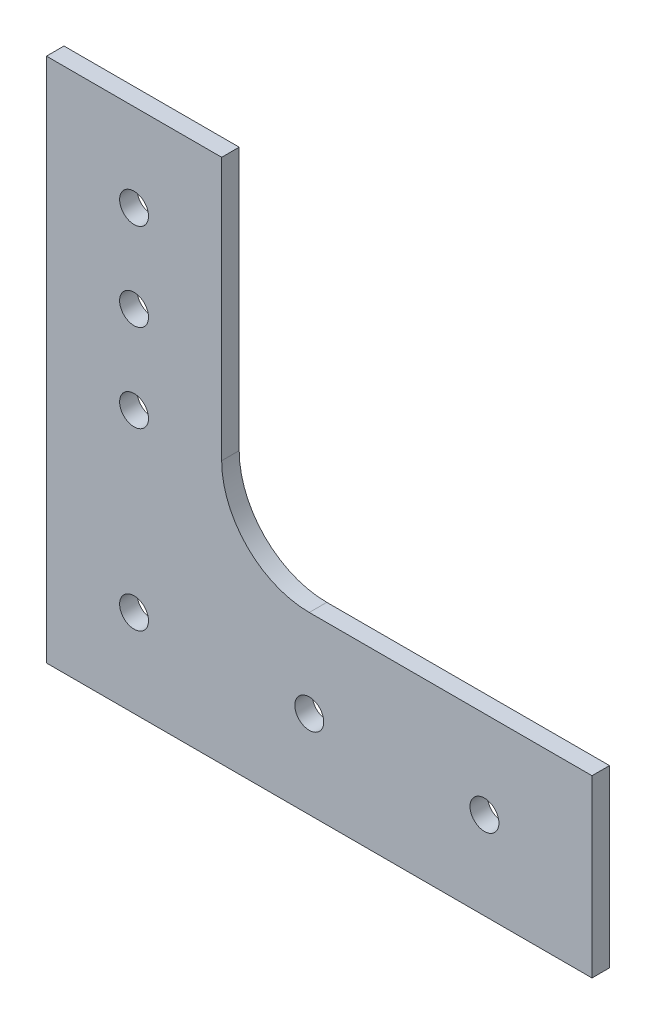
ISO-10303-21;
HEADER;
FILE_DESCRIPTION(('STEP AP214'),'2;1');
FILE_NAME('part.step','',(''),(''),'','','');
FILE_SCHEMA(('AUTOMOTIVE_DESIGN { 1 0 10303 214 1 1 1 1 }'));
ENDSEC;
DATA;
#1=APPLICATION_CONTEXT('core data for automotive mechanical design processes');
#2=APPLICATION_PROTOCOL_DEFINITION('international standard','automotive_design',2000,#1);
#3=PRODUCT_CONTEXT('',#1,'mechanical');
#4=PRODUCT('Part','Part','',(#3));
#5=PRODUCT_RELATED_PRODUCT_CATEGORY('part','',(#4));
#6=PRODUCT_DEFINITION_FORMATION('','',#4);
#7=PRODUCT_DEFINITION_CONTEXT('part definition',#1,'design');
#8=PRODUCT_DEFINITION('design','',#6,#7);
#9=PRODUCT_DEFINITION_SHAPE('','',#8);
#10=(LENGTH_UNIT() NAMED_UNIT(*) SI_UNIT(.MILLI.,.METRE.));
#11=(NAMED_UNIT(*) PLANE_ANGLE_UNIT() SI_UNIT($,.RADIAN.));
#12=(NAMED_UNIT(*) SI_UNIT($,.STERADIAN.) SOLID_ANGLE_UNIT());
#13=UNCERTAINTY_MEASURE_WITH_UNIT(LENGTH_MEASURE(1.E-05),#10,'distance_accuracy_value','');
#14=(GEOMETRIC_REPRESENTATION_CONTEXT(3) GLOBAL_UNCERTAINTY_ASSIGNED_CONTEXT((#13)) GLOBAL_UNIT_ASSIGNED_CONTEXT((#10,
#11,#12)) REPRESENTATION_CONTEXT('',''));
#15=CARTESIAN_POINT('',(0.,0.,0.));
#16=DIRECTION('',(0.,0.,1.));
#17=DIRECTION('',(1.,0.,0.));
#18=AXIS2_PLACEMENT_3D('',#15,#16,#17);
#19=CARTESIAN_POINT('',(0.,0.,2.));
#20=DIRECTION('',(0.,0.,-1.));
#21=DIRECTION('',(-1.,0.,0.));
#22=AXIS2_PLACEMENT_3D('',#19,#20,#21);
#23=PLANE('',#22);
#24=DIRECTION('',(0.,1.,0.));
#25=VECTOR('',#24,1.);
#26=CARTESIAN_POINT('',(52.2764122765606,-10.,2.));
#27=LINE('',#26,#25);
#28=CARTESIAN_POINT('',(52.2764122765606,-10.,2.));
#29=VERTEX_POINT('',#28);
#30=CARTESIAN_POINT('',(52.2764122765606,10.,2.));
#31=VERTEX_POINT('',#30);
#32=EDGE_CURVE('E105',#29,#31,#27,.T.);
#33=ORIENTED_EDGE('',*,*,#32,.T.);
#34=DIRECTION('',(-1.,0.,0.));
#35=VECTOR('',#34,1.);
#36=CARTESIAN_POINT('',(10.,10.,2.));
#37=LINE('',#36,#35);
#38=CARTESIAN_POINT('',(20.,10.,2.));
#39=VERTEX_POINT('',#38);
#40=EDGE_CURVE('E96',#31,#39,#37,.T.);
#41=ORIENTED_EDGE('',*,*,#40,.T.);
#42=CARTESIAN_POINT('',(20.,20.,2.));
#43=DIRECTION('',(0.,0.,-1.));
#44=DIRECTION('',(-1.,0.,0.));
#45=AXIS2_PLACEMENT_3D('',#42,#43,#44);
#46=CIRCLE('',#45,10.);
#47=CARTESIAN_POINT('',(10.,20.,2.));
#48=VERTEX_POINT('',#47);
#49=EDGE_CURVE('E11',#39,#48,#46,.T.);
#50=ORIENTED_EDGE('',*,*,#49,.T.);
#51=DIRECTION('',(0.,1.,0.));
#52=VECTOR('',#51,1.);
#53=CARTESIAN_POINT('',(10.,10.,2.));
#54=LINE('',#53,#52);
#55=CARTESIAN_POINT('',(10.,50.,2.));
#56=VERTEX_POINT('',#55);
#57=EDGE_CURVE('E104',#48,#56,#54,.T.);
#58=ORIENTED_EDGE('',*,*,#57,.T.);
#59=DIRECTION('',(-1.,0.,0.));
#60=VECTOR('',#59,1.);
#61=CARTESIAN_POINT('',(-9.99999999999999,50.,2.));
#62=LINE('',#61,#60);
#63=CARTESIAN_POINT('',(-9.99999999999999,50.,2.));
#64=VERTEX_POINT('',#63);
#65=EDGE_CURVE('E151',#56,#64,#62,.T.);
#66=ORIENTED_EDGE('',*,*,#65,.T.);
#67=DIRECTION('',(0.,-1.,0.));
#68=VECTOR('',#67,1.);
#69=CARTESIAN_POINT('',(-9.99999999999999,10.,2.));
#70=LINE('',#69,#68);
#71=CARTESIAN_POINT('',(-9.99999999999999,-10.,2.));
#72=VERTEX_POINT('',#71);
#73=EDGE_CURVE('E149',#64,#72,#70,.T.);
#74=ORIENTED_EDGE('',*,*,#73,.T.);
#75=DIRECTION('',(1.,0.,0.));
#76=VECTOR('',#75,1.);
#77=CARTESIAN_POINT('',(-9.99999999999999,-10.,2.));
#78=LINE('',#77,#76);
#79=EDGE_CURVE('E110',#72,#29,#78,.T.);
#80=ORIENTED_EDGE('',*,*,#79,.T.);
#81=EDGE_LOOP('',(#33,#41,#50,#58,#66,#74,#80));
#82=FACE_BOUND('',#81,.T.);
#83=CARTESIAN_POINT('',(0.,0.,2.));
#84=DIRECTION('',(0.,0.,1.));
#85=DIRECTION('',(1.,0.,0.));
#86=AXIS2_PLACEMENT_3D('',#83,#84,#85);
#87=CIRCLE('',#86,1.65);
#88=CARTESIAN_POINT('',(1.65,0.,2.));
#89=VERTEX_POINT('',#88);
#90=EDGE_CURVE('E147',#89,#89,#87,.T.);
#91=ORIENTED_EDGE('',*,*,#90,.F.);
#92=EDGE_LOOP('',(#91));
#93=FACE_BOUND('',#92,.T.);
#94=CARTESIAN_POINT('',(20.,0.,2.));
#95=DIRECTION('',(0.,0.,1.));
#96=DIRECTION('',(1.,0.,0.));
#97=AXIS2_PLACEMENT_3D('',#94,#95,#96);
#98=CIRCLE('',#97,1.65);
#99=CARTESIAN_POINT('',(21.65,0.,2.));
#100=VERTEX_POINT('',#99);
#101=EDGE_CURVE('E157',#100,#100,#98,.T.);
#102=ORIENTED_EDGE('',*,*,#101,.F.);
#103=EDGE_LOOP('',(#102));
#104=FACE_BOUND('',#103,.T.);
#105=CARTESIAN_POINT('',(3.05033872050053E-05,20.,2.));
#106=DIRECTION('',(0.,0.,1.));
#107=DIRECTION('',(1.,0.,0.));
#108=AXIS2_PLACEMENT_3D('',#105,#106,#107);
#109=CIRCLE('',#108,1.65);
#110=CARTESIAN_POINT('',(1.6500305033872,20.,2.));
#111=VERTEX_POINT('',#110);
#112=EDGE_CURVE('E163',#111,#111,#109,.T.);
#113=ORIENTED_EDGE('',*,*,#112,.F.);
#114=EDGE_LOOP('',(#113));
#115=FACE_BOUND('',#114,.T.);
#116=CARTESIAN_POINT('',(3.05033872050053E-05,30.,2.));
#117=DIRECTION('',(0.,0.,1.));
#118=DIRECTION('',(1.,0.,0.));
#119=AXIS2_PLACEMENT_3D('',#116,#117,#118);
#120=CIRCLE('',#119,1.65);
#121=CARTESIAN_POINT('',(1.6500305033872,30.,2.));
#122=VERTEX_POINT('',#121);
#123=EDGE_CURVE('E169',#122,#122,#120,.T.);
#124=ORIENTED_EDGE('',*,*,#123,.F.);
#125=EDGE_LOOP('',(#124));
#126=FACE_BOUND('',#125,.T.);
#127=CARTESIAN_POINT('',(3.05033872065226E-05,40.,2.));
#128=DIRECTION('',(0.,0.,1.));
#129=DIRECTION('',(1.,0.,0.));
#130=AXIS2_PLACEMENT_3D('',#127,#128,#129);
#131=CIRCLE('',#130,1.65);
#132=CARTESIAN_POINT('',(1.65003050338721,40.,2.));
#133=VERTEX_POINT('',#132);
#134=EDGE_CURVE('E175',#133,#133,#131,.T.);
#135=ORIENTED_EDGE('',*,*,#134,.F.);
#136=EDGE_LOOP('',(#135));
#137=FACE_BOUND('',#136,.T.);
#138=CARTESIAN_POINT('',(40.,0.,2.));
#139=DIRECTION('',(0.,0.,1.));
#140=DIRECTION('',(1.,0.,0.));
#141=AXIS2_PLACEMENT_3D('',#138,#139,#140);
#142=CIRCLE('',#141,1.65);
#143=CARTESIAN_POINT('',(41.65,0.,2.));
#144=VERTEX_POINT('',#143);
#145=EDGE_CURVE('E181',#144,#144,#142,.T.);
#146=ORIENTED_EDGE('',*,*,#145,.F.);
#147=EDGE_LOOP('',(#146));
#148=FACE_BOUND('',#147,.T.);
#149=ADVANCED_FACE('F41',(#82,#93,#104,#115,#126,#137,#148),#23,.F.);
#150=CARTESIAN_POINT('',(0.,0.,0.));
#151=DIRECTION('',(0.,0.,-1.));
#152=DIRECTION('',(-1.,0.,0.));
#153=AXIS2_PLACEMENT_3D('',#150,#151,#152);
#154=PLANE('',#153);
#155=CARTESIAN_POINT('',(3.05033872065226E-05,40.,0.));
#156=DIRECTION('',(0.,0.,1.));
#157=DIRECTION('',(1.,0.,0.));
#158=AXIS2_PLACEMENT_3D('',#155,#156,#157);
#159=CIRCLE('',#158,1.65);
#160=CARTESIAN_POINT('',(1.65003050338721,40.,0.));
#161=VERTEX_POINT('',#160);
#162=EDGE_CURVE('E178',#161,#161,#159,.T.);
#163=ORIENTED_EDGE('',*,*,#162,.T.);
#164=EDGE_LOOP('',(#163));
#165=FACE_BOUND('',#164,.T.);
#166=CARTESIAN_POINT('',(3.05033872050053E-05,20.,0.));
#167=DIRECTION('',(0.,0.,1.));
#168=DIRECTION('',(1.,0.,0.));
#169=AXIS2_PLACEMENT_3D('',#166,#167,#168);
#170=CIRCLE('',#169,1.65);
#171=CARTESIAN_POINT('',(1.6500305033872,20.,0.));
#172=VERTEX_POINT('',#171);
#173=EDGE_CURVE('E166',#172,#172,#170,.T.);
#174=ORIENTED_EDGE('',*,*,#173,.T.);
#175=EDGE_LOOP('',(#174));
#176=FACE_BOUND('',#175,.T.);
#177=CARTESIAN_POINT('',(0.,0.,0.));
#178=DIRECTION('',(0.,0.,1.));
#179=DIRECTION('',(1.,0.,0.));
#180=AXIS2_PLACEMENT_3D('',#177,#178,#179);
#181=CIRCLE('',#180,1.65);
#182=CARTESIAN_POINT('',(1.65,0.,0.));
#183=VERTEX_POINT('',#182);
#184=EDGE_CURVE('E154',#183,#183,#181,.T.);
#185=ORIENTED_EDGE('',*,*,#184,.T.);
#186=EDGE_LOOP('',(#185));
#187=FACE_BOUND('',#186,.T.);
#188=DIRECTION('',(0.,1.,0.));
#189=VECTOR('',#188,1.);
#190=CARTESIAN_POINT('',(52.2764122765606,-10.,0.));
#191=LINE('',#190,#189);
#192=CARTESIAN_POINT('',(52.2764122765606,-10.,0.));
#193=VERTEX_POINT('',#192);
#194=CARTESIAN_POINT('',(52.2764122765606,10.,0.));
#195=VERTEX_POINT('',#194);
#196=EDGE_CURVE('E118',#193,#195,#191,.T.);
#197=ORIENTED_EDGE('',*,*,#196,.F.);
#198=DIRECTION('',(1.,0.,0.));
#199=VECTOR('',#198,1.);
#200=CARTESIAN_POINT('',(-9.99999999999999,-10.,0.));
#201=LINE('',#200,#199);
#202=CARTESIAN_POINT('',(-9.99999999999999,-10.,0.));
#203=VERTEX_POINT('',#202);
#204=EDGE_CURVE('E114',#203,#193,#201,.T.);
#205=ORIENTED_EDGE('',*,*,#204,.F.);
#206=DIRECTION('',(0.,-1.,0.));
#207=VECTOR('',#206,1.);
#208=CARTESIAN_POINT('',(-9.99999999999999,10.,0.));
#209=LINE('',#208,#207);
#210=CARTESIAN_POINT('',(-9.99999999999999,50.,0.));
#211=VERTEX_POINT('',#210);
#212=EDGE_CURVE('E137',#211,#203,#209,.T.);
#213=ORIENTED_EDGE('',*,*,#212,.F.);
#214=DIRECTION('',(-1.,0.,0.));
#215=VECTOR('',#214,1.);
#216=CARTESIAN_POINT('',(-9.99999999999999,50.,0.));
#217=LINE('',#216,#215);
#218=CARTESIAN_POINT('',(10.,50.,0.));
#219=VERTEX_POINT('',#218);
#220=EDGE_CURVE('E139',#219,#211,#217,.T.);
#221=ORIENTED_EDGE('',*,*,#220,.F.);
#222=DIRECTION('',(0.,1.,0.));
#223=VECTOR('',#222,1.);
#224=CARTESIAN_POINT('',(10.,10.,0.));
#225=LINE('',#224,#223);
#226=CARTESIAN_POINT('',(10.,20.,0.));
#227=VERTEX_POINT('',#226);
#228=EDGE_CURVE('E142',#227,#219,#225,.T.);
#229=ORIENTED_EDGE('',*,*,#228,.F.);
#230=CARTESIAN_POINT('',(20.,20.,0.));
#231=DIRECTION('',(0.,0.,-1.));
#232=DIRECTION('',(-1.,0.,0.));
#233=AXIS2_PLACEMENT_3D('',#230,#231,#232);
#234=CIRCLE('',#233,10.);
#235=CARTESIAN_POINT('',(20.,10.,0.));
#236=VERTEX_POINT('',#235);
#237=EDGE_CURVE('E49',#227,#236,#234,.F.);
#238=ORIENTED_EDGE('',*,*,#237,.T.);
#239=DIRECTION('',(-1.,0.,0.));
#240=VECTOR('',#239,1.);
#241=CARTESIAN_POINT('',(10.,10.,0.));
#242=LINE('',#241,#240);
#243=EDGE_CURVE('E144',#195,#236,#242,.T.);
#244=ORIENTED_EDGE('',*,*,#243,.F.);
#245=EDGE_LOOP('',(#197,#205,#213,#221,#229,#238,#244));
#246=FACE_BOUND('',#245,.T.);
#247=CARTESIAN_POINT('',(20.,0.,0.));
#248=DIRECTION('',(0.,0.,1.));
#249=DIRECTION('',(1.,0.,0.));
#250=AXIS2_PLACEMENT_3D('',#247,#248,#249);
#251=CIRCLE('',#250,1.65);
#252=CARTESIAN_POINT('',(21.65,0.,0.));
#253=VERTEX_POINT('',#252);
#254=EDGE_CURVE('E160',#253,#253,#251,.T.);
#255=ORIENTED_EDGE('',*,*,#254,.T.);
#256=EDGE_LOOP('',(#255));
#257=FACE_BOUND('',#256,.T.);
#258=CARTESIAN_POINT('',(3.05033872050053E-05,30.,0.));
#259=DIRECTION('',(0.,0.,1.));
#260=DIRECTION('',(1.,0.,0.));
#261=AXIS2_PLACEMENT_3D('',#258,#259,#260);
#262=CIRCLE('',#261,1.65);
#263=CARTESIAN_POINT('',(1.6500305033872,30.,0.));
#264=VERTEX_POINT('',#263);
#265=EDGE_CURVE('E172',#264,#264,#262,.T.);
#266=ORIENTED_EDGE('',*,*,#265,.T.);
#267=EDGE_LOOP('',(#266));
#268=FACE_BOUND('',#267,.T.);
#269=CARTESIAN_POINT('',(40.,0.,0.));
#270=DIRECTION('',(0.,0.,1.));
#271=DIRECTION('',(1.,0.,0.));
#272=AXIS2_PLACEMENT_3D('',#269,#270,#271);
#273=CIRCLE('',#272,1.65);
#274=CARTESIAN_POINT('',(41.65,0.,0.));
#275=VERTEX_POINT('',#274);
#276=EDGE_CURVE('E184',#275,#275,#273,.T.);
#277=ORIENTED_EDGE('',*,*,#276,.T.);
#278=EDGE_LOOP('',(#277));
#279=FACE_BOUND('',#278,.T.);
#280=ADVANCED_FACE('F194',(#165,#176,#187,#246,#257,#268,#279),#154,.T.);
#281=CARTESIAN_POINT('',(52.2764122765606,-10.,2.));
#282=DIRECTION('',(-1.,0.,0.));
#283=DIRECTION('',(0.,0.,1.));
#284=AXIS2_PLACEMENT_3D('',#281,#282,#283);
#285=PLANE('',#284);
#286=ORIENTED_EDGE('',*,*,#196,.T.);
#287=DIRECTION('',(0.,0.,-1.));
#288=VECTOR('',#287,1.);
#289=CARTESIAN_POINT('',(52.2764122765606,10.,2.));
#290=LINE('',#289,#288);
#291=EDGE_CURVE('E100',#31,#195,#290,.T.);
#292=ORIENTED_EDGE('',*,*,#291,.F.);
#293=ORIENTED_EDGE('',*,*,#32,.F.);
#294=DIRECTION('',(0.,0.,-1.));
#295=VECTOR('',#294,1.);
#296=CARTESIAN_POINT('',(52.2764122765606,-10.,2.));
#297=LINE('',#296,#295);
#298=EDGE_CURVE('E134',#29,#193,#297,.T.);
#299=ORIENTED_EDGE('',*,*,#298,.T.);
#300=EDGE_LOOP('',(#286,#292,#293,#299));
#301=FACE_BOUND('',#300,.T.);
#302=ADVANCED_FACE('F116',(#301),#285,.F.);
#303=CARTESIAN_POINT('',(10.,10.,2.));
#304=DIRECTION('',(0.,-1.,0.));
#305=DIRECTION('',(0.,0.,-1.));
#306=AXIS2_PLACEMENT_3D('',#303,#304,#305);
#307=PLANE('',#306);
#308=ORIENTED_EDGE('',*,*,#243,.T.);
#309=DIRECTION('',(0.,0.,-1.));
#310=VECTOR('',#309,1.);
#311=CARTESIAN_POINT('',(20.,10.,2.));
#312=LINE('',#311,#310);
#313=EDGE_CURVE('E56',#236,#39,#312,.F.);
#314=ORIENTED_EDGE('',*,*,#313,.T.);
#315=ORIENTED_EDGE('',*,*,#40,.F.);
#316=ORIENTED_EDGE('',*,*,#291,.T.);
#317=EDGE_LOOP('',(#308,#314,#315,#316));
#318=FACE_BOUND('',#317,.T.);
#319=ADVANCED_FACE('F98',(#318),#307,.F.);
#320=CARTESIAN_POINT('',(10.,10.,2.));
#321=DIRECTION('',(-1.,0.,0.));
#322=DIRECTION('',(0.,0.,1.));
#323=AXIS2_PLACEMENT_3D('',#320,#321,#322);
#324=PLANE('',#323);
#325=ORIENTED_EDGE('',*,*,#57,.F.);
#326=DIRECTION('',(0.,0.,-1.));
#327=VECTOR('',#326,1.);
#328=CARTESIAN_POINT('',(10.,20.,0.));
#329=LINE('',#328,#327);
#330=EDGE_CURVE('E119',#48,#227,#329,.T.);
#331=ORIENTED_EDGE('',*,*,#330,.T.);
#332=ORIENTED_EDGE('',*,*,#228,.T.);
#333=DIRECTION('',(0.,0.,-1.));
#334=VECTOR('',#333,1.);
#335=CARTESIAN_POINT('',(10.,50.,2.));
#336=LINE('',#335,#334);
#337=EDGE_CURVE('E120',#56,#219,#336,.T.);
#338=ORIENTED_EDGE('',*,*,#337,.F.);
#339=EDGE_LOOP('',(#325,#331,#332,#338));
#340=FACE_BOUND('',#339,.T.);
#341=ADVANCED_FACE('F217',(#340),#324,.F.);
#342=CARTESIAN_POINT('',(-9.99999999999999,50.,2.));
#343=DIRECTION('',(0.,-1.,0.));
#344=DIRECTION('',(0.,0.,-1.));
#345=AXIS2_PLACEMENT_3D('',#342,#343,#344);
#346=PLANE('',#345);
#347=ORIENTED_EDGE('',*,*,#220,.T.);
#348=DIRECTION('',(0.,0.,-1.));
#349=VECTOR('',#348,1.);
#350=CARTESIAN_POINT('',(-9.99999999999999,50.,2.));
#351=LINE('',#350,#349);
#352=EDGE_CURVE('E125',#64,#211,#351,.T.);
#353=ORIENTED_EDGE('',*,*,#352,.F.);
#354=ORIENTED_EDGE('',*,*,#65,.F.);
#355=ORIENTED_EDGE('',*,*,#337,.T.);
#356=EDGE_LOOP('',(#347,#353,#354,#355));
#357=FACE_BOUND('',#356,.T.);
#358=ADVANCED_FACE('F213',(#357),#346,.F.);
#359=CARTESIAN_POINT('',(-9.99999999999999,10.,2.));
#360=DIRECTION('',(1.,0.,0.));
#361=DIRECTION('',(0.,1.,0.));
#362=AXIS2_PLACEMENT_3D('',#359,#360,#361);
#363=PLANE('',#362);
#364=ORIENTED_EDGE('',*,*,#212,.T.);
#365=DIRECTION('',(0.,0.,-1.));
#366=VECTOR('',#365,1.);
#367=CARTESIAN_POINT('',(-9.99999999999999,-10.,2.));
#368=LINE('',#367,#366);
#369=EDGE_CURVE('E131',#72,#203,#368,.T.);
#370=ORIENTED_EDGE('',*,*,#369,.F.);
#371=ORIENTED_EDGE('',*,*,#73,.F.);
#372=ORIENTED_EDGE('',*,*,#352,.T.);
#373=EDGE_LOOP('',(#364,#370,#371,#372));
#374=FACE_BOUND('',#373,.T.);
#375=ADVANCED_FACE('F209',(#374),#363,.F.);
#376=CARTESIAN_POINT('',(-9.99999999999999,-10.,2.));
#377=DIRECTION('',(0.,1.,0.));
#378=DIRECTION('',(0.,0.,1.));
#379=AXIS2_PLACEMENT_3D('',#376,#377,#378);
#380=PLANE('',#379);
#381=ORIENTED_EDGE('',*,*,#204,.T.);
#382=ORIENTED_EDGE('',*,*,#298,.F.);
#383=ORIENTED_EDGE('',*,*,#79,.F.);
#384=ORIENTED_EDGE('',*,*,#369,.T.);
#385=EDGE_LOOP('',(#381,#382,#383,#384));
#386=FACE_BOUND('',#385,.T.);
#387=ADVANCED_FACE('F206',(#386),#380,.F.);
#388=CARTESIAN_POINT('',(0.,0.,2.));
#389=DIRECTION('',(0.,0.,-1.));
#390=DIRECTION('',(-1.,0.,0.));
#391=AXIS2_PLACEMENT_3D('',#388,#389,#390);
#392=CYLINDRICAL_SURFACE('',#391,1.65);
#393=ORIENTED_EDGE('',*,*,#90,.T.);
#394=EDGE_LOOP('',(#393));
#395=FACE_BOUND('',#394,.T.);
#396=ORIENTED_EDGE('',*,*,#184,.F.);
#397=EDGE_LOOP('',(#396));
#398=FACE_BOUND('',#397,.T.);
#399=ADVANCED_FACE('F203',(#395,#398),#392,.F.);
#400=CARTESIAN_POINT('',(20.,0.,2.));
#401=DIRECTION('',(0.,0.,-1.));
#402=DIRECTION('',(-1.,0.,0.));
#403=AXIS2_PLACEMENT_3D('',#400,#401,#402);
#404=CYLINDRICAL_SURFACE('',#403,1.65);
#405=ORIENTED_EDGE('',*,*,#101,.T.);
#406=EDGE_LOOP('',(#405));
#407=FACE_BOUND('',#406,.T.);
#408=ORIENTED_EDGE('',*,*,#254,.F.);
#409=EDGE_LOOP('',(#408));
#410=FACE_BOUND('',#409,.T.);
#411=ADVANCED_FACE('F251',(#407,#410),#404,.F.);
#412=CARTESIAN_POINT('',(3.05033872050053E-05,20.,2.));
#413=DIRECTION('',(0.,0.,-1.));
#414=DIRECTION('',(-1.,0.,0.));
#415=AXIS2_PLACEMENT_3D('',#412,#413,#414);
#416=CYLINDRICAL_SURFACE('',#415,1.65);
#417=ORIENTED_EDGE('',*,*,#112,.T.);
#418=EDGE_LOOP('',(#417));
#419=FACE_BOUND('',#418,.T.);
#420=ORIENTED_EDGE('',*,*,#173,.F.);
#421=EDGE_LOOP('',(#420));
#422=FACE_BOUND('',#421,.T.);
#423=ADVANCED_FACE('F259',(#419,#422),#416,.F.);
#424=CARTESIAN_POINT('',(3.05033872050053E-05,30.,2.));
#425=DIRECTION('',(0.,0.,-1.));
#426=DIRECTION('',(-1.,0.,0.));
#427=AXIS2_PLACEMENT_3D('',#424,#425,#426);
#428=CYLINDRICAL_SURFACE('',#427,1.65);
#429=ORIENTED_EDGE('',*,*,#123,.T.);
#430=EDGE_LOOP('',(#429));
#431=FACE_BOUND('',#430,.T.);
#432=ORIENTED_EDGE('',*,*,#265,.F.);
#433=EDGE_LOOP('',(#432));
#434=FACE_BOUND('',#433,.T.);
#435=ADVANCED_FACE('F267',(#431,#434),#428,.F.);
#436=CARTESIAN_POINT('',(3.05033872065226E-05,40.,2.));
#437=DIRECTION('',(0.,0.,-1.));
#438=DIRECTION('',(-1.,0.,0.));
#439=AXIS2_PLACEMENT_3D('',#436,#437,#438);
#440=CYLINDRICAL_SURFACE('',#439,1.65);
#441=ORIENTED_EDGE('',*,*,#134,.T.);
#442=EDGE_LOOP('',(#441));
#443=FACE_BOUND('',#442,.T.);
#444=ORIENTED_EDGE('',*,*,#162,.F.);
#445=EDGE_LOOP('',(#444));
#446=FACE_BOUND('',#445,.T.);
#447=ADVANCED_FACE('F276',(#443,#446),#440,.F.);
#448=CARTESIAN_POINT('',(40.,0.,2.));
#449=DIRECTION('',(0.,0.,-1.));
#450=DIRECTION('',(-1.,0.,0.));
#451=AXIS2_PLACEMENT_3D('',#448,#449,#450);
#452=CYLINDRICAL_SURFACE('',#451,1.65);
#453=ORIENTED_EDGE('',*,*,#145,.T.);
#454=EDGE_LOOP('',(#453));
#455=FACE_BOUND('',#454,.T.);
#456=ORIENTED_EDGE('',*,*,#276,.F.);
#457=EDGE_LOOP('',(#456));
#458=FACE_BOUND('',#457,.T.);
#459=ADVANCED_FACE('F190',(#455,#458),#452,.F.);
#460=CARTESIAN_POINT('',(20.,20.,2.));
#461=DIRECTION('',(0.,0.,1.));
#462=DIRECTION('',(1.,0.,0.));
#463=AXIS2_PLACEMENT_3D('',#460,#461,#462);
#464=CYLINDRICAL_SURFACE('',#463,10.);
#465=ORIENTED_EDGE('',*,*,#49,.F.);
#466=ORIENTED_EDGE('',*,*,#313,.F.);
#467=ORIENTED_EDGE('',*,*,#237,.F.);
#468=ORIENTED_EDGE('',*,*,#330,.F.);
#469=EDGE_LOOP('',(#465,#466,#467,#468));
#470=FACE_BOUND('',#469,.T.);
#471=ADVANCED_FACE('F43',(#470),#464,.F.);
#472=CLOSED_SHELL('',(#149,#280,#302,#319,#341,#358,#375,#387,#399,#411,#423,#435,#447,#459,#471));
#473=MANIFOLD_SOLID_BREP('B2',#472);
#474=ADVANCED_BREP_SHAPE_REPRESENTATION('',(#18,#473),#14);
#475=SHAPE_DEFINITION_REPRESENTATION(#9,#474);
ENDSEC;
END-ISO-10303-21;
